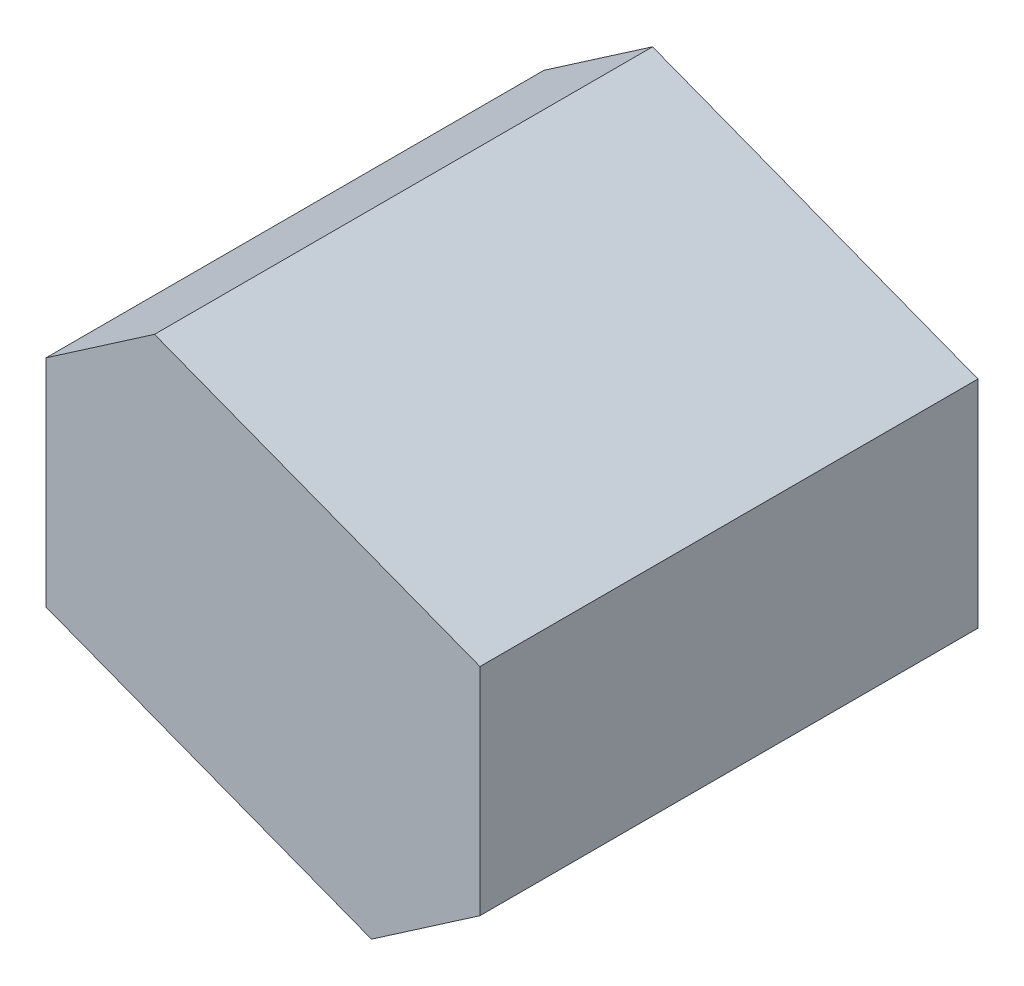
ISO-10303-21;
HEADER;
FILE_DESCRIPTION(('STEP AP214'),'2;1');
FILE_NAME('part.step','',(''),(''),'','','');
FILE_SCHEMA(('AUTOMOTIVE_DESIGN { 1 0 10303 214 1 1 1 1 }'));
ENDSEC;
DATA;
#1=APPLICATION_CONTEXT('core data for automotive mechanical design processes');
#2=APPLICATION_PROTOCOL_DEFINITION('international standard','automotive_design',2000,#1);
#3=PRODUCT_CONTEXT('',#1,'mechanical');
#4=PRODUCT('Part','Part','',(#3));
#5=PRODUCT_RELATED_PRODUCT_CATEGORY('part','',(#4));
#6=PRODUCT_DEFINITION_FORMATION('','',#4);
#7=PRODUCT_DEFINITION_CONTEXT('part definition',#1,'design');
#8=PRODUCT_DEFINITION('design','',#6,#7);
#9=PRODUCT_DEFINITION_SHAPE('','',#8);
#10=(LENGTH_UNIT() NAMED_UNIT(*) SI_UNIT(.MILLI.,.METRE.));
#11=(NAMED_UNIT(*) PLANE_ANGLE_UNIT() SI_UNIT($,.RADIAN.));
#12=(NAMED_UNIT(*) SI_UNIT($,.STERADIAN.) SOLID_ANGLE_UNIT());
#13=UNCERTAINTY_MEASURE_WITH_UNIT(LENGTH_MEASURE(1.E-05),#10,'distance_accuracy_value','');
#14=(GEOMETRIC_REPRESENTATION_CONTEXT(3) GLOBAL_UNCERTAINTY_ASSIGNED_CONTEXT((#13)) GLOBAL_UNIT_ASSIGNED_CONTEXT((#10,
#11,#12)) REPRESENTATION_CONTEXT('',''));
#15=CARTESIAN_POINT('',(0.,0.,0.));
#16=DIRECTION('',(0.,0.,1.));
#17=DIRECTION('',(1.,0.,0.));
#18=AXIS2_PLACEMENT_3D('',#15,#16,#17);
#19=CARTESIAN_POINT('',(33.1981199662404,-0.0871285716620917,38.1));
#20=DIRECTION('',(-0.358367949545305,-0.9335804264972,0.));
#21=DIRECTION('',(0.9335804264972,-0.358367949545305,0.));
#22=AXIS2_PLACEMENT_3D('',#19,#20,#21);
#23=PLANE('',#22);
#24=DIRECTION('',(-0.9335804264972,0.358367949545305,0.));
#25=VECTOR('',#24,1.);
#26=CARTESIAN_POINT('',(33.1981199662404,-0.0871285716620917,-38.1));
#27=LINE('',#26,#25);
#28=CARTESIAN_POINT('',(33.1981199662404,-0.0871285716620917,-38.1));
#29=VERTEX_POINT('',#28);
#30=CARTESIAN_POINT('',(-16.5990599831202,19.0282178570845,-38.1));
#31=VERTEX_POINT('',#30);
#32=EDGE_CURVE('E218',#29,#31,#27,.T.);
#33=ORIENTED_EDGE('',*,*,#32,.T.);
#34=DIRECTION('',(0.,0.,1.));
#35=VECTOR('',#34,1.);
#36=CARTESIAN_POINT('',(-16.5990599831202,19.0282178570845,-38.1));
#37=LINE('',#36,#35);
#38=CARTESIAN_POINT('',(-16.5990599831202,19.0282178570845,38.1));
#39=VERTEX_POINT('',#38);
#40=EDGE_CURVE('E405',#31,#39,#37,.T.);
#41=ORIENTED_EDGE('',*,*,#40,.T.);
#42=DIRECTION('',(-0.9335804264972,0.358367949545305,0.));
#43=VECTOR('',#42,1.);
#44=CARTESIAN_POINT('',(33.1981199662404,-0.0871285716620917,38.1));
#45=LINE('',#44,#43);
#46=CARTESIAN_POINT('',(33.1981199662404,-0.0871285716620917,38.1));
#47=VERTEX_POINT('',#46);
#48=EDGE_CURVE('E220',#47,#39,#45,.T.);
#49=ORIENTED_EDGE('',*,*,#48,.F.);
#50=DIRECTION('',(0.,0.,-1.));
#51=VECTOR('',#50,1.);
#52=CARTESIAN_POINT('',(33.1981199662404,-0.0871285716620917,38.1));
#53=LINE('',#52,#51);
#54=EDGE_CURVE('E232',#47,#29,#53,.T.);
#55=ORIENTED_EDGE('',*,*,#54,.T.);
#56=EDGE_LOOP('',(#33,#41,#49,#55));
#57=FACE_BOUND('',#56,.T.);
#58=ADVANCED_FACE('F47',(#57),#23,.F.);
#59=CARTESIAN_POINT('',(-33.1981199662404,25.4,38.1));
#60=DIRECTION('',(1.,0.,0.));
#61=DIRECTION('',(0.,1.,0.));
#62=AXIS2_PLACEMENT_3D('',#59,#60,#61);
#63=PLANE('',#62);
#64=DIRECTION('',(0.,-1.,0.));
#65=VECTOR('',#64,1.);
#66=CARTESIAN_POINT('',(-33.1981199662404,25.4,38.1));
#67=LINE('',#66,#65);
#68=CARTESIAN_POINT('',(-33.1981199662404,7.62,38.1));
#69=VERTEX_POINT('',#68);
#70=CARTESIAN_POINT('',(-33.1981199662404,-25.4,38.1));
#71=VERTEX_POINT('',#70);
#72=EDGE_CURVE('E226',#69,#71,#67,.T.);
#73=ORIENTED_EDGE('',*,*,#72,.F.);
#74=DIRECTION('',(0.,0.,1.));
#75=VECTOR('',#74,1.);
#76=CARTESIAN_POINT('',(-33.1981199662404,7.62,-38.1));
#77=LINE('',#76,#75);
#78=CARTESIAN_POINT('',(-33.1981199662404,7.62,-38.1));
#79=VERTEX_POINT('',#78);
#80=EDGE_CURVE('E410',#79,#69,#77,.T.);
#81=ORIENTED_EDGE('',*,*,#80,.F.);
#82=DIRECTION('',(0.,-1.,0.));
#83=VECTOR('',#82,1.);
#84=CARTESIAN_POINT('',(-33.1981199662404,25.4,-38.1));
#85=LINE('',#84,#83);
#86=CARTESIAN_POINT('',(-33.1981199662404,-25.4,-38.1));
#87=VERTEX_POINT('',#86);
#88=EDGE_CURVE('E228',#79,#87,#85,.T.);
#89=ORIENTED_EDGE('',*,*,#88,.T.);
#90=DIRECTION('',(0.,0.,-1.));
#91=VECTOR('',#90,1.);
#92=CARTESIAN_POINT('',(-33.1981199662404,-25.4,38.1));
#93=LINE('',#92,#91);
#94=EDGE_CURVE('E235',#71,#87,#93,.T.);
#95=ORIENTED_EDGE('',*,*,#94,.F.);
#96=EDGE_LOOP('',(#73,#81,#89,#95));
#97=FACE_BOUND('',#96,.T.);
#98=ADVANCED_FACE('F433',(#97),#63,.F.);
#99=CARTESIAN_POINT('',(-33.1981199662404,-25.4,38.1));
#100=DIRECTION('',(0.358367949545305,0.9335804264972,0.));
#101=DIRECTION('',(-0.9335804264972,0.358367949545305,0.));
#102=AXIS2_PLACEMENT_3D('',#99,#100,#101);
#103=PLANE('',#102);
#104=DIRECTION('',(0.9335804264972,-0.358367949545305,0.));
#105=VECTOR('',#104,1.);
#106=CARTESIAN_POINT('',(-33.1981199662404,-25.4,-38.1));
#107=LINE('',#106,#105);
#108=CARTESIAN_POINT('',(16.5990599831202,-44.5153464287465,-38.1));
#109=VERTEX_POINT('',#108);
#110=EDGE_CURVE('E221',#87,#109,#107,.T.);
#111=ORIENTED_EDGE('',*,*,#110,.T.);
#112=DIRECTION('',(0.,0.,1.));
#113=VECTOR('',#112,1.);
#114=CARTESIAN_POINT('',(16.5990599831202,-44.5153464287465,-38.1));
#115=LINE('',#114,#113);
#116=CARTESIAN_POINT('',(16.5990599831202,-44.5153464287465,38.1));
#117=VERTEX_POINT('',#116);
#118=EDGE_CURVE('E197',#109,#117,#115,.T.);
#119=ORIENTED_EDGE('',*,*,#118,.T.);
#120=DIRECTION('',(0.9335804264972,-0.358367949545305,0.));
#121=VECTOR('',#120,1.);
#122=CARTESIAN_POINT('',(-33.1981199662404,-25.4,38.1));
#123=LINE('',#122,#121);
#124=EDGE_CURVE('E420',#71,#117,#123,.T.);
#125=ORIENTED_EDGE('',*,*,#124,.F.);
#126=ORIENTED_EDGE('',*,*,#94,.T.);
#127=EDGE_LOOP('',(#111,#119,#125,#126));
#128=FACE_BOUND('',#127,.T.);
#129=ADVANCED_FACE('F436',(#128),#103,.F.);
#130=CARTESIAN_POINT('',(33.1981199662404,-50.8871285716621,38.1));
#131=DIRECTION('',(-1.,0.,0.));
#132=DIRECTION('',(0.,-1.,0.));
#133=AXIS2_PLACEMENT_3D('',#130,#131,#132);
#134=PLANE('',#133);
#135=DIRECTION('',(0.,1.,0.));
#136=VECTOR('',#135,1.);
#137=CARTESIAN_POINT('',(33.1981199662404,-50.8871285716621,38.1));
#138=LINE('',#137,#136);
#139=CARTESIAN_POINT('',(33.1981199662404,-33.1071285716621,38.1));
#140=VERTEX_POINT('',#139);
#141=EDGE_CURVE('E211',#140,#47,#138,.T.);
#142=ORIENTED_EDGE('',*,*,#141,.F.);
#143=DIRECTION('',(0.,0.,1.));
#144=VECTOR('',#143,1.);
#145=CARTESIAN_POINT('',(33.1981199662404,-33.1071285716621,-38.1));
#146=LINE('',#145,#144);
#147=CARTESIAN_POINT('',(33.1981199662404,-33.1071285716621,-38.1));
#148=VERTEX_POINT('',#147);
#149=EDGE_CURVE('E194',#148,#140,#146,.T.);
#150=ORIENTED_EDGE('',*,*,#149,.F.);
#151=DIRECTION('',(0.,1.,0.));
#152=VECTOR('',#151,1.);
#153=CARTESIAN_POINT('',(33.1981199662404,-50.8871285716621,-38.1));
#154=LINE('',#153,#152);
#155=EDGE_CURVE('E209',#148,#29,#154,.T.);
#156=ORIENTED_EDGE('',*,*,#155,.T.);
#157=ORIENTED_EDGE('',*,*,#54,.F.);
#158=EDGE_LOOP('',(#142,#150,#156,#157));
#159=FACE_BOUND('',#158,.T.);
#160=ADVANCED_FACE('F207',(#159),#134,.F.);
#161=CARTESIAN_POINT('',(0.,0.,38.1));
#162=DIRECTION('',(0.,0.,1.));
#163=DIRECTION('',(1.,0.,0.));
#164=AXIS2_PLACEMENT_3D('',#161,#162,#163);
#165=PLANE('',#164);
#166=DIRECTION('',(-0.824126188622017,-0.566406236924831,0.));
#167=VECTOR('',#166,1.);
#168=CARTESIAN_POINT('',(16.5990599831202,-44.5153464287465,38.1));
#169=LINE('',#168,#167);
#170=EDGE_CURVE('E203',#140,#117,#169,.T.);
#171=ORIENTED_EDGE('',*,*,#170,.F.);
#172=ORIENTED_EDGE('',*,*,#141,.T.);
#173=ORIENTED_EDGE('',*,*,#48,.T.);
#174=DIRECTION('',(0.824126188622017,0.566406236924831,0.));
#175=VECTOR('',#174,1.);
#176=CARTESIAN_POINT('',(-16.5990599831202,19.0282178570845,38.1));
#177=LINE('',#176,#175);
#178=EDGE_CURVE('E402',#69,#39,#177,.T.);
#179=ORIENTED_EDGE('',*,*,#178,.F.);
#180=ORIENTED_EDGE('',*,*,#72,.T.);
#181=ORIENTED_EDGE('',*,*,#124,.T.);
#182=EDGE_LOOP('',(#171,#172,#173,#179,#180,#181));
#183=FACE_BOUND('',#182,.T.);
#184=ADVANCED_FACE('F438',(#183),#165,.T.);
#185=CARTESIAN_POINT('',(0.,0.,-38.1));
#186=DIRECTION('',(0.,0.,1.));
#187=DIRECTION('',(1.,0.,0.));
#188=AXIS2_PLACEMENT_3D('',#185,#186,#187);
#189=PLANE('',#188);
#190=DIRECTION('',(-0.824126188622017,-0.566406236924831,0.));
#191=VECTOR('',#190,1.);
#192=CARTESIAN_POINT('',(25.6250156975658,-37.2846291998315,-38.1));
#193=LINE('',#192,#191);
#194=CARTESIAN_POINT('',(24.2188228587639,-38.251078762062,-38.1));
#195=VERTEX_POINT('',#194);
#196=CARTESIAN_POINT('',(24.1959093085186,-38.2668268088396,-38.1));
#197=VERTEX_POINT('',#196);
#198=EDGE_CURVE('E387',#195,#197,#193,.T.);
#199=ORIENTED_EDGE('',*,*,#198,.F.);
#200=CARTESIAN_POINT('',(14.1481199662404,-23.5981151283625,-38.1));
#201=DIRECTION('',(0.,0.,1.));
#202=DIRECTION('',(1.,0.,0.));
#203=AXIS2_PLACEMENT_3D('',#200,#201,#202);
#204=CIRCLE('',#203,17.78);
#205=CARTESIAN_POINT('',(31.9281199662404,-23.5981151283625,-38.1));
#206=VERTEX_POINT('',#205);
#207=EDGE_CURVE('E11',#195,#206,#204,.T.);
#208=ORIENTED_EDGE('',*,*,#207,.T.);
#209=DIRECTION('',(0.,1.,0.));
#210=VECTOR('',#209,1.);
#211=CARTESIAN_POINT('',(31.9281199662404,-50.8871285716621,-38.1));
#212=LINE('',#211,#210);
#213=CARTESIAN_POINT('',(31.9281199662404,-12.7263785454803,-38.1));
#214=VERTEX_POINT('',#213);
#215=EDGE_CURVE('E413',#206,#214,#212,.T.);
#216=ORIENTED_EDGE('',*,*,#215,.T.);
#217=CARTESIAN_POINT('',(14.1481199662404,-12.7263785454803,-38.1));
#218=DIRECTION('',(0.,0.,1.));
#219=DIRECTION('',(1.,0.,0.));
#220=AXIS2_PLACEMENT_3D('',#217,#218,#219);
#221=CIRCLE('',#220,17.78);
#222=CARTESIAN_POINT('',(20.5199021091559,3.8726814376399,-38.1));
#223=VERTEX_POINT('',#222);
#224=EDGE_CURVE('E314',#214,#223,#221,.T.);
#225=ORIENTED_EDGE('',*,*,#224,.T.);
#226=DIRECTION('',(-0.9335804264972,0.358367949545305,0.));
#227=VECTOR('',#226,1.);
#228=CARTESIAN_POINT('',(32.8947020723769,-0.877559208998293,-38.1));
#229=LINE('',#228,#227);
#230=CARTESIAN_POINT('',(-7.75342427307957,14.7257945865983,-38.1));
#231=VERTEX_POINT('',#230);
#232=EDGE_CURVE('E394',#223,#231,#229,.T.);
#233=ORIENTED_EDGE('',*,*,#232,.T.);
#234=CARTESIAN_POINT('',(-14.1252064159951,-1.87326539652195,-38.1));
#235=DIRECTION('',(0.,0.,1.));
#236=DIRECTION('',(1.,0.,0.));
#237=AXIS2_PLACEMENT_3D('',#234,#235,#236);
#238=CIRCLE('',#237,17.78);
#239=CARTESIAN_POINT('',(-24.1959093085186,12.7796982371775,-38.1));
#240=VERTEX_POINT('',#239);
#241=EDGE_CURVE('E311',#231,#240,#238,.T.);
#242=ORIENTED_EDGE('',*,*,#241,.T.);
#243=DIRECTION('',(0.824126188622017,0.566406236924831,0.));
#244=VECTOR('',#243,1.);
#245=CARTESIAN_POINT('',(-13.7278735165052,19.9741799109885,-38.1));
#246=LINE('',#245,#244);
#247=CARTESIAN_POINT('',(-24.6421570387639,12.4730006693607,-38.1));
#248=VERTEX_POINT('',#247);
#249=EDGE_CURVE('E383',#248,#240,#246,.T.);
#250=ORIENTED_EDGE('',*,*,#249,.F.);
#251=CARTESIAN_POINT('',(-14.5714541462404,-2.17996296433876,-38.1));
#252=DIRECTION('',(0.,0.,1.));
#253=DIRECTION('',(1.,0.,0.));
#254=AXIS2_PLACEMENT_3D('',#251,#252,#253);
#255=CIRCLE('',#254,17.78);
#256=CARTESIAN_POINT('',(-32.3514541462404,-2.17996296433876,-38.1));
#257=VERTEX_POINT('',#256);
#258=EDGE_CURVE('E317',#248,#257,#255,.T.);
#259=ORIENTED_EDGE('',*,*,#258,.T.);
#260=DIRECTION('',(0.,-1.,0.));
#261=VECTOR('',#260,1.);
#262=CARTESIAN_POINT('',(-32.3514541462404,25.4,-38.1));
#263=LINE('',#262,#261);
#264=CARTESIAN_POINT('',(-32.3514541462404,-12.5982472596786,-38.1));
#265=VERTEX_POINT('',#264);
#266=EDGE_CURVE('E397',#257,#265,#263,.T.);
#267=ORIENTED_EDGE('',*,*,#266,.T.);
#268=CARTESIAN_POINT('',(-14.5714541462404,-12.5982472596786,-38.1));
#269=DIRECTION('',(0.,0.,1.));
#270=DIRECTION('',(1.,0.,0.));
#271=AXIS2_PLACEMENT_3D('',#268,#269,#270);
#272=CIRCLE('',#271,17.78);
#273=CARTESIAN_POINT('',(-20.9432362891559,-29.1973072427988,-38.1));
#274=VERTEX_POINT('',#273);
#275=EDGE_CURVE('E57',#265,#274,#272,.T.);
#276=ORIENTED_EDGE('',*,*,#275,.T.);
#277=DIRECTION('',(0.9335804264972,-0.358367949545305,0.));
#278=VECTOR('',#277,1.);
#279=CARTESIAN_POINT('',(-32.8947020723769,-24.6095693626638,-38.1));
#280=LINE('',#279,#278);
#281=CARTESIAN_POINT('',(7.75342427307955,-40.2129231582603,-38.1));
#282=VERTEX_POINT('',#281);
#283=EDGE_CURVE('E516',#274,#282,#280,.T.);
#284=ORIENTED_EDGE('',*,*,#283,.T.);
#285=CARTESIAN_POINT('',(14.1252064159951,-23.6138631751401,-38.1));
#286=DIRECTION('',(0.,0.,1.));
#287=DIRECTION('',(1.,0.,0.));
#288=AXIS2_PLACEMENT_3D('',#285,#286,#287);
#289=CIRCLE('',#288,17.78);
#290=EDGE_CURVE('E320',#282,#197,#289,.T.);
#291=ORIENTED_EDGE('',*,*,#290,.T.);
#292=EDGE_LOOP('',(#199,#208,#216,#225,#233,#242,#250,#259,#267,#276,#284,#291));
#293=FACE_BOUND('',#292,.T.);
#294=ORIENTED_EDGE('',*,*,#155,.F.);
#295=DIRECTION('',(-0.824126188622017,-0.566406236924831,0.));
#296=VECTOR('',#295,1.);
#297=CARTESIAN_POINT('',(16.5990599831202,-44.5153464287465,-38.1));
#298=LINE('',#297,#296);
#299=EDGE_CURVE('E191',#148,#109,#298,.T.);
#300=ORIENTED_EDGE('',*,*,#299,.T.);
#301=ORIENTED_EDGE('',*,*,#110,.F.);
#302=ORIENTED_EDGE('',*,*,#88,.F.);
#303=DIRECTION('',(0.824126188622017,0.566406236924831,0.));
#304=VECTOR('',#303,1.);
#305=CARTESIAN_POINT('',(-16.5990599831202,19.0282178570845,-38.1));
#306=LINE('',#305,#304);
#307=EDGE_CURVE('E409',#79,#31,#306,.T.);
#308=ORIENTED_EDGE('',*,*,#307,.T.);
#309=ORIENTED_EDGE('',*,*,#32,.F.);
#310=EDGE_LOOP('',(#294,#300,#301,#302,#308,#309));
#311=FACE_BOUND('',#310,.T.);
#312=ADVANCED_FACE('F215',(#293,#311),#189,.F.);
#313=CARTESIAN_POINT('',(-16.5990599831202,19.0282178570845,-38.1));
#314=DIRECTION('',(0.566406236924831,-0.824126188622017,0.));
#315=DIRECTION('',(0.824126188622017,0.566406236924831,0.));
#316=AXIS2_PLACEMENT_3D('',#313,#314,#315);
#317=PLANE('',#316);
#318=ORIENTED_EDGE('',*,*,#178,.T.);
#319=ORIENTED_EDGE('',*,*,#40,.F.);
#320=ORIENTED_EDGE('',*,*,#307,.F.);
#321=ORIENTED_EDGE('',*,*,#80,.T.);
#322=EDGE_LOOP('',(#318,#319,#320,#321));
#323=FACE_BOUND('',#322,.T.);
#324=ADVANCED_FACE('F442',(#323),#317,.F.);
#325=CARTESIAN_POINT('',(16.5990599831202,-44.5153464287465,-38.1));
#326=DIRECTION('',(-0.566406236924831,0.824126188622017,0.));
#327=DIRECTION('',(-0.824126188622017,-0.566406236924831,0.));
#328=AXIS2_PLACEMENT_3D('',#325,#326,#327);
#329=PLANE('',#328);
#330=ORIENTED_EDGE('',*,*,#170,.T.);
#331=ORIENTED_EDGE('',*,*,#118,.F.);
#332=ORIENTED_EDGE('',*,*,#299,.F.);
#333=ORIENTED_EDGE('',*,*,#149,.T.);
#334=EDGE_LOOP('',(#330,#331,#332,#333));
#335=FACE_BOUND('',#334,.T.);
#336=ADVANCED_FACE('F193',(#335),#329,.F.);
#337=CARTESIAN_POINT('',(32.8947020723769,-0.877559208998293,38.1));
#338=DIRECTION('',(-0.358367949545305,-0.9335804264972,0.));
#339=DIRECTION('',(0.9335804264972,-0.358367949545305,0.));
#340=AXIS2_PLACEMENT_3D('',#337,#338,#339);
#341=PLANE('',#340);
#342=DIRECTION('',(-0.9335804264972,0.358367949545305,0.));
#343=VECTOR('',#342,1.);
#344=CARTESIAN_POINT('',(32.8947020723769,-0.877559208998293,19.47333418));
#345=LINE('',#344,#343);
#346=CARTESIAN_POINT('',(20.5199021091559,3.8726814376399,19.47333418));
#347=VERTEX_POINT('',#346);
#348=CARTESIAN_POINT('',(-7.75342427307956,14.7257945865983,19.47333418));
#349=VERTEX_POINT('',#348);
#350=EDGE_CURVE('E249',#347,#349,#345,.T.);
#351=ORIENTED_EDGE('',*,*,#350,.T.);
#352=DIRECTION('',(0.,0.,1.));
#353=VECTOR('',#352,1.);
#354=CARTESIAN_POINT('',(-7.75342427307956,14.7257945865983,-38.1));
#355=LINE('',#354,#353);
#356=EDGE_CURVE('E255',#349,#231,#355,.F.);
#357=ORIENTED_EDGE('',*,*,#356,.T.);
#358=ORIENTED_EDGE('',*,*,#232,.F.);
#359=DIRECTION('',(0.,0.,-1.));
#360=VECTOR('',#359,1.);
#361=CARTESIAN_POINT('',(20.5199021091559,3.8726814376399,37.25333418));
#362=LINE('',#361,#360);
#363=EDGE_CURVE('E252',#223,#347,#362,.F.);
#364=ORIENTED_EDGE('',*,*,#363,.T.);
#365=EDGE_LOOP('',(#351,#357,#358,#364));
#366=FACE_BOUND('',#365,.T.);
#367=ADVANCED_FACE('F538',(#366),#341,.T.);
#368=CARTESIAN_POINT('',(-32.3514541462404,25.4,38.1));
#369=DIRECTION('',(1.,0.,0.));
#370=DIRECTION('',(0.,1.,0.));
#371=AXIS2_PLACEMENT_3D('',#368,#369,#370);
#372=PLANE('',#371);
#373=ORIENTED_EDGE('',*,*,#266,.F.);
#374=DIRECTION('',(0.,0.,1.));
#375=VECTOR('',#374,1.);
#376=CARTESIAN_POINT('',(-32.3514541462404,-2.17996296433876,37.25333418));
#377=LINE('',#376,#375);
#378=CARTESIAN_POINT('',(-32.3514541462404,-2.17996296433876,19.47333418));
#379=VERTEX_POINT('',#378);
#380=EDGE_CURVE('E289',#257,#379,#377,.T.);
#381=ORIENTED_EDGE('',*,*,#380,.T.);
#382=DIRECTION('',(0.,-1.,0.));
#383=VECTOR('',#382,1.);
#384=CARTESIAN_POINT('',(-32.3514541462404,25.4,19.47333418));
#385=LINE('',#384,#383);
#386=CARTESIAN_POINT('',(-32.3514541462404,-12.5982472596786,19.47333418));
#387=VERTEX_POINT('',#386);
#388=EDGE_CURVE('E286',#379,#387,#385,.T.);
#389=ORIENTED_EDGE('',*,*,#388,.T.);
#390=DIRECTION('',(0.,0.,-1.));
#391=VECTOR('',#390,1.);
#392=CARTESIAN_POINT('',(-32.3514541462404,-12.5982472596786,-38.1));
#393=LINE('',#392,#391);
#394=EDGE_CURVE('E283',#387,#265,#393,.T.);
#395=ORIENTED_EDGE('',*,*,#394,.T.);
#396=EDGE_LOOP('',(#373,#381,#389,#395));
#397=FACE_BOUND('',#396,.T.);
#398=ADVANCED_FACE('F568',(#397),#372,.T.);
#399=CARTESIAN_POINT('',(-32.8947020723769,-24.6095693626638,38.1));
#400=DIRECTION('',(0.358367949545305,0.9335804264972,0.));
#401=DIRECTION('',(-0.9335804264972,0.358367949545305,0.));
#402=AXIS2_PLACEMENT_3D('',#399,#400,#401);
#403=PLANE('',#402);
#404=DIRECTION('',(0.9335804264972,-0.358367949545305,0.));
#405=VECTOR('',#404,1.);
#406=CARTESIAN_POINT('',(-32.8947020723769,-24.6095693626638,19.47333418));
#407=LINE('',#406,#405);
#408=CARTESIAN_POINT('',(-20.9432362891559,-29.1973072427988,19.47333418));
#409=VERTEX_POINT('',#408);
#410=CARTESIAN_POINT('',(7.75342427307955,-40.2129231582603,19.47333418));
#411=VERTEX_POINT('',#410);
#412=EDGE_CURVE('E65',#409,#411,#407,.T.);
#413=ORIENTED_EDGE('',*,*,#412,.T.);
#414=DIRECTION('',(0.,0.,1.));
#415=VECTOR('',#414,1.);
#416=CARTESIAN_POINT('',(7.75342427307955,-40.2129231582603,-38.1));
#417=LINE('',#416,#415);
#418=EDGE_CURVE('E308',#411,#282,#417,.F.);
#419=ORIENTED_EDGE('',*,*,#418,.T.);
#420=ORIENTED_EDGE('',*,*,#283,.F.);
#421=DIRECTION('',(0.,0.,-1.));
#422=VECTOR('',#421,1.);
#423=CARTESIAN_POINT('',(-20.9432362891559,-29.1973072427988,37.25333418));
#424=LINE('',#423,#422);
#425=EDGE_CURVE('E70',#274,#409,#424,.F.);
#426=ORIENTED_EDGE('',*,*,#425,.T.);
#427=EDGE_LOOP('',(#413,#419,#420,#426));
#428=FACE_BOUND('',#427,.T.);
#429=ADVANCED_FACE('F572',(#428),#403,.T.);
#430=CARTESIAN_POINT('',(31.9281199662404,-50.8871285716621,38.1));
#431=DIRECTION('',(-1.,0.,0.));
#432=DIRECTION('',(0.,-1.,0.));
#433=AXIS2_PLACEMENT_3D('',#430,#431,#432);
#434=PLANE('',#433);
#435=DIRECTION('',(0.,1.,0.));
#436=VECTOR('',#435,1.);
#437=CARTESIAN_POINT('',(31.9281199662404,-50.8871285716621,19.47333418));
#438=LINE('',#437,#436);
#439=CARTESIAN_POINT('',(31.9281199662404,-23.5981151283625,19.47333418));
#440=VERTEX_POINT('',#439);
#441=CARTESIAN_POINT('',(31.9281199662404,-12.7263785454803,19.47333418));
#442=VERTEX_POINT('',#441);
#443=EDGE_CURVE('E261',#440,#442,#438,.T.);
#444=ORIENTED_EDGE('',*,*,#443,.T.);
#445=DIRECTION('',(0.,0.,-1.));
#446=VECTOR('',#445,1.);
#447=CARTESIAN_POINT('',(31.9281199662404,-12.7263785454803,-38.1));
#448=LINE('',#447,#446);
#449=EDGE_CURVE('E264',#442,#214,#448,.T.);
#450=ORIENTED_EDGE('',*,*,#449,.T.);
#451=ORIENTED_EDGE('',*,*,#215,.F.);
#452=DIRECTION('',(0.,0.,1.));
#453=VECTOR('',#452,1.);
#454=CARTESIAN_POINT('',(31.9281199662404,-23.5981151283625,37.25333418));
#455=LINE('',#454,#453);
#456=EDGE_CURVE('E258',#206,#440,#455,.T.);
#457=ORIENTED_EDGE('',*,*,#456,.T.);
#458=EDGE_LOOP('',(#444,#450,#451,#457));
#459=FACE_BOUND('',#458,.T.);
#460=ADVANCED_FACE('F527',(#459),#434,.T.);
#461=CARTESIAN_POINT('',(0.,0.,37.25333418));
#462=DIRECTION('',(0.,0.,1.));
#463=DIRECTION('',(1.,0.,0.));
#464=AXIS2_PLACEMENT_3D('',#461,#462,#463);
#465=PLANE('',#464);
#466=DIRECTION('',(0.824126188622017,0.566406236924831,0.));
#467=VECTOR('',#466,1.);
#468=CARTESIAN_POINT('',(-3.65717062398166,5.32121627728899,37.25333418));
#469=LINE('',#468,#467);
#470=CARTESIAN_POINT('',(-14.5714541462404,-2.17996296433876,37.25333418));
#471=VERTEX_POINT('',#470);
#472=CARTESIAN_POINT('',(-14.1252064159951,-1.87326539652195,37.25333418));
#473=VERTEX_POINT('',#472);
#474=EDGE_CURVE('E276',#471,#473,#469,.T.);
#475=ORIENTED_EDGE('',*,*,#474,.T.);
#476=DIRECTION('',(-0.9335804264972,0.358367949545305,0.));
#477=VECTOR('',#476,1.);
#478=CARTESIAN_POINT('',(-2.44079578489708,-6.35849040838601,37.25333418));
#479=LINE('',#478,#477);
#480=CARTESIAN_POINT('',(14.1481199662404,-12.7263785454803,37.25333418));
#481=VERTEX_POINT('',#480);
#482=EDGE_CURVE('E279',#473,#481,#479,.F.);
#483=ORIENTED_EDGE('',*,*,#482,.T.);
#484=DIRECTION('',(0.,1.,0.));
#485=VECTOR('',#484,1.);
#486=CARTESIAN_POINT('',(14.1481199662404,0.,37.25333418));
#487=LINE('',#486,#485);
#488=CARTESIAN_POINT('',(14.1481199662404,-23.6226588629943,37.25333418));
#489=VERTEX_POINT('',#488);
#490=EDGE_CURVE('E267',#481,#489,#487,.F.);
#491=ORIENTED_EDGE('',*,*,#490,.T.);
#492=DIRECTION('',(0.9335804264972,-0.358367949545305,0.));
#493=VECTOR('',#492,1.);
#494=CARTESIAN_POINT('',(-6.08631311285423,-15.8553877345988,37.25333418));
#495=LINE('',#494,#493);
#496=CARTESIAN_POINT('',(-14.5714541462404,-12.5982472596786,37.25333418));
#497=VERTEX_POINT('',#496);
#498=EDGE_CURVE('E270',#489,#497,#495,.F.);
#499=ORIENTED_EDGE('',*,*,#498,.T.);
#500=DIRECTION('',(0.,-1.,0.));
#501=VECTOR('',#500,1.);
#502=CARTESIAN_POINT('',(-14.5714541462404,0.,37.25333418));
#503=LINE('',#502,#501);
#504=EDGE_CURVE('E273',#497,#471,#503,.F.);
#505=ORIENTED_EDGE('',*,*,#504,.T.);
#506=EDGE_LOOP('',(#475,#483,#491,#499,#505));
#507=FACE_BOUND('',#506,.T.);
#508=ADVANCED_FACE('F558',(#507),#465,.F.);
#509=CARTESIAN_POINT('',(-16.1195031820811,18.3304583818113,-38.1));
#510=DIRECTION('',(0.566406236924831,-0.824126188622017,0.));
#511=DIRECTION('',(0.824126188622017,0.566406236924831,0.));
#512=AXIS2_PLACEMENT_3D('',#509,#510,#511);
#513=PLANE('',#512);
#514=ORIENTED_EDGE('',*,*,#249,.T.);
#515=DIRECTION('',(0.,0.,1.));
#516=VECTOR('',#515,1.);
#517=CARTESIAN_POINT('',(-24.1959093085186,12.7796982371775,37.25333418));
#518=LINE('',#517,#516);
#519=CARTESIAN_POINT('',(-24.1959093085186,12.7796982371775,19.47333418));
#520=VERTEX_POINT('',#519);
#521=EDGE_CURVE('E245',#240,#520,#518,.T.);
#522=ORIENTED_EDGE('',*,*,#521,.T.);
#523=DIRECTION('',(0.824126188622017,0.566406236924831,0.));
#524=VECTOR('',#523,1.);
#525=CARTESIAN_POINT('',(-16.1195031820811,18.3304583818113,19.47333418));
#526=LINE('',#525,#524);
#527=CARTESIAN_POINT('',(-24.6421570387639,12.4730006693607,19.47333418));
#528=VERTEX_POINT('',#527);
#529=EDGE_CURVE('E242',#520,#528,#526,.F.);
#530=ORIENTED_EDGE('',*,*,#529,.T.);
#531=DIRECTION('',(0.,0.,1.));
#532=VECTOR('',#531,1.);
#533=CARTESIAN_POINT('',(-24.6421570387639,12.4730006693607,-38.1));
#534=LINE('',#533,#532);
#535=EDGE_CURVE('E239',#528,#248,#534,.F.);
#536=ORIENTED_EDGE('',*,*,#535,.T.);
#537=EDGE_LOOP('',(#514,#522,#530,#536));
#538=FACE_BOUND('',#537,.T.);
#539=ADVANCED_FACE('F585',(#538),#513,.T.);
#540=CARTESIAN_POINT('',(16.1195031820811,-43.8175869534734,-38.1));
#541=DIRECTION('',(-0.566406236924831,0.824126188622017,0.));
#542=DIRECTION('',(-0.824126188622017,-0.566406236924831,0.));
#543=AXIS2_PLACEMENT_3D('',#540,#541,#542);
#544=PLANE('',#543);
#545=ORIENTED_EDGE('',*,*,#198,.T.);
#546=DIRECTION('',(0.,0.,1.));
#547=VECTOR('',#546,1.);
#548=CARTESIAN_POINT('',(24.1959093085186,-38.2668268088396,37.25333418));
#549=LINE('',#548,#547);
#550=CARTESIAN_POINT('',(24.1959093085186,-38.2668268088396,34.1262978136995));
#551=VERTEX_POINT('',#550);
#552=EDGE_CURVE('E301',#197,#551,#549,.T.);
#553=ORIENTED_EDGE('',*,*,#552,.T.);
#554=CARTESIAN_POINT('',(34.2666122010421,-31.345424471074,19.47333418));
#555=DIRECTION('',(-0.566406236924831,0.824126188622017,0.));
#556=DIRECTION('',(0.824126188622017,0.566406236924831,0.));
#557=AXIS2_PLACEMENT_3D('',#554,#555,#556);
#558=ELLIPSE('',#557,21.574365971465,17.78);
#559=CARTESIAN_POINT('',(24.2073660836412,-38.2589527854508,34.1341652461284));
#560=VERTEX_POINT('',#559);
#561=EDGE_CURVE('E298',#551,#560,#558,.T.);
#562=ORIENTED_EDGE('',*,*,#561,.T.);
#563=CARTESIAN_POINT('',(14.1481199662404,-45.1724810998275,19.47333418));
#564=DIRECTION('',(-0.566406236924831,0.824126188622017,0.));
#565=DIRECTION('',(0.824126188622017,0.566406236924831,0.));
#566=AXIS2_PLACEMENT_3D('',#563,#564,#565);
#567=ELLIPSE('',#566,21.574365971465,17.78);
#568=CARTESIAN_POINT('',(24.2188228587639,-38.251078762062,34.1262978136995));
#569=VERTEX_POINT('',#568);
#570=EDGE_CURVE('E295',#560,#569,#567,.T.);
#571=ORIENTED_EDGE('',*,*,#570,.T.);
#572=DIRECTION('',(0.,0.,1.));
#573=VECTOR('',#572,1.);
#574=CARTESIAN_POINT('',(24.2188228587639,-38.251078762062,-38.1));
#575=LINE('',#574,#573);
#576=EDGE_CURVE('E292',#569,#195,#575,.F.);
#577=ORIENTED_EDGE('',*,*,#576,.T.);
#578=EDGE_LOOP('',(#545,#553,#562,#571,#577));
#579=FACE_BOUND('',#578,.T.);
#580=ADVANCED_FACE('F507',(#579),#544,.T.);
#581=CARTESIAN_POINT('',(-14.5714541462404,-12.5982472596786,38.1));
#582=DIRECTION('',(0.,0.,1.));
#583=DIRECTION('',(1.,0.,0.));
#584=AXIS2_PLACEMENT_3D('',#581,#582,#583);
#585=CYLINDRICAL_SURFACE('',#584,17.78);
#586=ORIENTED_EDGE('',*,*,#275,.F.);
#587=ORIENTED_EDGE('',*,*,#394,.F.);
#588=CARTESIAN_POINT('',(-14.5714541462404,-12.5982472596786,19.47333418));
#589=DIRECTION('',(0.,0.,-1.));
#590=DIRECTION('',(-1.,0.,0.));
#591=AXIS2_PLACEMENT_3D('',#588,#589,#590);
#592=CIRCLE('',#591,17.78);
#593=EDGE_CURVE('E51',#409,#387,#592,.T.);
#594=ORIENTED_EDGE('',*,*,#593,.F.);
#595=ORIENTED_EDGE('',*,*,#425,.F.);
#596=EDGE_LOOP('',(#586,#587,#594,#595));
#597=FACE_BOUND('',#596,.T.);
#598=ADVANCED_FACE('F49',(#597),#585,.F.);
#599=CARTESIAN_POINT('',(14.1252064159951,-23.6138631751401,-38.1));
#600=DIRECTION('',(0.,0.,-1.));
#601=DIRECTION('',(-1.,0.,0.));
#602=AXIS2_PLACEMENT_3D('',#599,#600,#601);
#603=CYLINDRICAL_SURFACE('',#602,17.78);
#604=ORIENTED_EDGE('',*,*,#290,.F.);
#605=ORIENTED_EDGE('',*,*,#418,.F.);
#606=CARTESIAN_POINT('',(14.1252064159951,-23.6138631751401,19.47333418));
#607=DIRECTION('',(0.660141050359199,-0.253404407283404,-0.707106781186547));
#608=DIRECTION('',(-0.660141050359199,0.253404407283404,-0.707106781186547));
#609=AXIS2_PLACEMENT_3D('',#606,#607,#608);
#610=ELLIPSE('',#609,25.1447171389936,17.78);
#611=EDGE_CURVE('E371',#551,#411,#610,.T.);
#612=ORIENTED_EDGE('',*,*,#611,.F.);
#613=ORIENTED_EDGE('',*,*,#552,.F.);
#614=EDGE_LOOP('',(#604,#605,#612,#613));
#615=FACE_BOUND('',#614,.T.);
#616=ADVANCED_FACE('F501',(#615),#603,.F.);
#617=CARTESIAN_POINT('',(-14.5714541462404,-12.5982472596786,19.47333418));
#618=DIRECTION('',(0.,0.,1.));
#619=DIRECTION('',(0.,-1.,0.));
#620=AXIS2_PLACEMENT_3D('',#617,#618,#619);
#621=SPHERICAL_SURFACE('',#620,17.78);
#622=CARTESIAN_POINT('',(-14.5714541462404,-12.5982472596786,19.47333418));
#623=DIRECTION('',(0.,1.,0.));
#624=DIRECTION('',(0.,0.,1.));
#625=AXIS2_PLACEMENT_3D('',#622,#623,#624);
#626=CIRCLE('',#625,17.78);
#627=EDGE_CURVE('E367',#497,#387,#626,.F.);
#628=ORIENTED_EDGE('',*,*,#627,.F.);
#629=CARTESIAN_POINT('',(-14.5714541462404,-12.5982472596786,19.47333418));
#630=DIRECTION('',(0.9335804264972,-0.358367949545305,0.));
#631=DIRECTION('',(0.358367949545305,0.9335804264972,0.));
#632=AXIS2_PLACEMENT_3D('',#629,#630,#631);
#633=CIRCLE('',#632,17.78);
#634=EDGE_CURVE('E374',#409,#497,#633,.F.);
#635=ORIENTED_EDGE('',*,*,#634,.F.);
#636=ORIENTED_EDGE('',*,*,#593,.T.);
#637=EDGE_LOOP('',(#628,#635,#636));
#638=FACE_BOUND('',#637,.T.);
#639=ADVANCED_FACE('F499',(#638),#621,.F.);
#640=CARTESIAN_POINT('',(-26.5229199294614,-8.01050937954358,19.47333418));
#641=DIRECTION('',(0.9335804264972,-0.358367949545305,0.));
#642=DIRECTION('',(0.358367949545305,0.9335804264972,0.));
#643=AXIS2_PLACEMENT_3D('',#640,#641,#642);
#644=CYLINDRICAL_SURFACE('',#643,17.78);
#645=ORIENTED_EDGE('',*,*,#634,.T.);
#646=ORIENTED_EDGE('',*,*,#498,.F.);
#647=CARTESIAN_POINT('',(14.1481199662404,-23.6226588629943,19.47333418));
#648=DIRECTION('',(0.824126188622017,0.566406236924831,0.));
#649=DIRECTION('',(0.566406236924831,-0.824126188622017,0.));
#650=AXIS2_PLACEMENT_3D('',#647,#648,#649);
#651=ELLIPSE('',#650,31.3908972763653,17.78);
#652=EDGE_CURVE('E363',#560,#489,#651,.F.);
#653=ORIENTED_EDGE('',*,*,#652,.F.);
#654=ORIENTED_EDGE('',*,*,#561,.F.);
#655=ORIENTED_EDGE('',*,*,#611,.T.);
#656=ORIENTED_EDGE('',*,*,#412,.F.);
#657=EDGE_LOOP('',(#645,#646,#653,#654,#655,#656));
#658=FACE_BOUND('',#657,.T.);
#659=ADVANCED_FACE('F495',(#658),#644,.F.);
#660=CARTESIAN_POINT('',(14.1481199662404,-23.5981151283625,38.1));
#661=DIRECTION('',(0.,0.,-1.));
#662=DIRECTION('',(-1.,0.,0.));
#663=AXIS2_PLACEMENT_3D('',#660,#661,#662);
#664=CYLINDRICAL_SURFACE('',#663,17.78);
#665=ORIENTED_EDGE('',*,*,#207,.F.);
#666=ORIENTED_EDGE('',*,*,#576,.F.);
#667=CARTESIAN_POINT('',(14.1481199662404,-23.5981151283625,19.47333418));
#668=DIRECTION('',(0.,0.707106781186547,0.707106781186547));
#669=DIRECTION('',(0.,0.707106781186547,-0.707106781186547));
#670=AXIS2_PLACEMENT_3D('',#667,#668,#669);
#671=ELLIPSE('',#670,25.1447171389936,17.78);
#672=EDGE_CURVE('E359',#440,#569,#671,.F.);
#673=ORIENTED_EDGE('',*,*,#672,.F.);
#674=ORIENTED_EDGE('',*,*,#456,.F.);
#675=EDGE_LOOP('',(#665,#666,#673,#674));
#676=FACE_BOUND('',#675,.T.);
#677=ADVANCED_FACE('F491',(#676),#664,.F.);
#678=CARTESIAN_POINT('',(-14.5714541462404,-2.17996296433876,38.1));
#679=DIRECTION('',(0.,0.,-1.));
#680=DIRECTION('',(-1.,0.,0.));
#681=AXIS2_PLACEMENT_3D('',#678,#679,#680);
#682=CYLINDRICAL_SURFACE('',#681,17.78);
#683=ORIENTED_EDGE('',*,*,#258,.F.);
#684=ORIENTED_EDGE('',*,*,#535,.F.);
#685=CARTESIAN_POINT('',(-14.5714541462404,-2.17996296433876,19.47333418));
#686=DIRECTION('',(0.,0.,-1.));
#687=DIRECTION('',(-1.,0.,0.));
#688=AXIS2_PLACEMENT_3D('',#685,#686,#687);
#689=CIRCLE('',#688,17.78);
#690=EDGE_CURVE('E355',#379,#528,#689,.T.);
#691=ORIENTED_EDGE('',*,*,#690,.F.);
#692=ORIENTED_EDGE('',*,*,#380,.F.);
#693=EDGE_LOOP('',(#683,#684,#691,#692));
#694=FACE_BOUND('',#693,.T.);
#695=ADVANCED_FACE('F487',(#694),#682,.F.);
#696=CARTESIAN_POINT('',(-14.5714541462404,25.4,19.47333418));
#697=DIRECTION('',(0.,-1.,0.));
#698=DIRECTION('',(1.,0.,0.));
#699=AXIS2_PLACEMENT_3D('',#696,#697,#698);
#700=CYLINDRICAL_SURFACE('',#699,17.78);
#701=ORIENTED_EDGE('',*,*,#627,.T.);
#702=ORIENTED_EDGE('',*,*,#388,.F.);
#703=CARTESIAN_POINT('',(-14.5714541462404,-2.17996296433876,19.47333418));
#704=DIRECTION('',(0.,-1.,0.));
#705=DIRECTION('',(1.,0.,0.));
#706=AXIS2_PLACEMENT_3D('',#703,#704,#705);
#707=CIRCLE('',#706,17.78);
#708=EDGE_CURVE('E351',#471,#379,#707,.T.);
#709=ORIENTED_EDGE('',*,*,#708,.F.);
#710=ORIENTED_EDGE('',*,*,#504,.F.);
#711=EDGE_LOOP('',(#701,#702,#709,#710));
#712=FACE_BOUND('',#711,.T.);
#713=ADVANCED_FACE('F483',(#712),#700,.F.);
#714=CARTESIAN_POINT('',(14.1481199662404,-50.8871285716621,19.47333418));
#715=DIRECTION('',(0.,1.,0.));
#716=DIRECTION('',(-1.,0.,0.));
#717=AXIS2_PLACEMENT_3D('',#714,#715,#716);
#718=CYLINDRICAL_SURFACE('',#717,17.78);
#719=ORIENTED_EDGE('',*,*,#652,.T.);
#720=ORIENTED_EDGE('',*,*,#490,.F.);
#721=CARTESIAN_POINT('',(14.1481199662404,-12.7263785454803,19.47333418));
#722=DIRECTION('',(0.,-1.,0.));
#723=DIRECTION('',(0.,0.,-1.));
#724=AXIS2_PLACEMENT_3D('',#721,#722,#723);
#725=CIRCLE('',#724,17.78);
#726=EDGE_CURVE('E347',#442,#481,#725,.T.);
#727=ORIENTED_EDGE('',*,*,#726,.F.);
#728=ORIENTED_EDGE('',*,*,#443,.F.);
#729=ORIENTED_EDGE('',*,*,#672,.T.);
#730=ORIENTED_EDGE('',*,*,#570,.F.);
#731=EDGE_LOOP('',(#719,#720,#727,#728,#729,#730));
#732=FACE_BOUND('',#731,.T.);
#733=ADVANCED_FACE('F479',(#732),#718,.F.);
#734=CARTESIAN_POINT('',(14.1481199662404,-12.7263785454803,38.1));
#735=DIRECTION('',(0.,0.,1.));
#736=DIRECTION('',(1.,0.,0.));
#737=AXIS2_PLACEMENT_3D('',#734,#735,#736);
#738=CYLINDRICAL_SURFACE('',#737,17.78);
#739=ORIENTED_EDGE('',*,*,#224,.F.);
#740=ORIENTED_EDGE('',*,*,#449,.F.);
#741=CARTESIAN_POINT('',(14.1481199662404,-12.7263785454803,19.47333418));
#742=DIRECTION('',(0.,0.,-1.));
#743=DIRECTION('',(-1.,0.,0.));
#744=AXIS2_PLACEMENT_3D('',#741,#742,#743);
#745=CIRCLE('',#744,17.78);
#746=EDGE_CURVE('E343',#347,#442,#745,.T.);
#747=ORIENTED_EDGE('',*,*,#746,.F.);
#748=ORIENTED_EDGE('',*,*,#363,.F.);
#749=EDGE_LOOP('',(#739,#740,#747,#748));
#750=FACE_BOUND('',#749,.T.);
#751=ADVANCED_FACE('F475',(#750),#738,.F.);
#752=CARTESIAN_POINT('',(-14.5714541462404,-2.17996296433876,19.47333418));
#753=DIRECTION('',(0.,0.,1.));
#754=DIRECTION('',(0.,-1.,0.));
#755=AXIS2_PLACEMENT_3D('',#752,#753,#754);
#756=SPHERICAL_SURFACE('',#755,17.78);
#757=ORIENTED_EDGE('',*,*,#708,.T.);
#758=ORIENTED_EDGE('',*,*,#690,.T.);
#759=CARTESIAN_POINT('',(-14.5714541462404,-2.17996296433876,19.47333418));
#760=DIRECTION('',(0.824126188622017,0.566406236924831,0.));
#761=DIRECTION('',(-0.566406236924831,0.824126188622017,0.));
#762=AXIS2_PLACEMENT_3D('',#759,#760,#761);
#763=CIRCLE('',#762,17.78);
#764=EDGE_CURVE('E339',#471,#528,#763,.F.);
#765=ORIENTED_EDGE('',*,*,#764,.F.);
#766=EDGE_LOOP('',(#757,#758,#765));
#767=FACE_BOUND('',#766,.T.);
#768=ADVANCED_FACE('F471',(#767),#756,.F.);
#769=CARTESIAN_POINT('',(14.1481199662404,-12.7263785454803,19.47333418));
#770=DIRECTION('',(0.,0.,1.));
#771=DIRECTION('',(1.,0.,0.));
#772=AXIS2_PLACEMENT_3D('',#769,#770,#771);
#773=SPHERICAL_SURFACE('',#772,17.78);
#774=ORIENTED_EDGE('',*,*,#746,.T.);
#775=ORIENTED_EDGE('',*,*,#726,.T.);
#776=CARTESIAN_POINT('',(14.1481199662404,-12.7263785454803,19.47333418));
#777=DIRECTION('',(-0.9335804264972,0.358367949545305,0.));
#778=DIRECTION('',(-0.358367949545305,-0.9335804264972,0.));
#779=AXIS2_PLACEMENT_3D('',#776,#777,#778);
#780=CIRCLE('',#779,17.78);
#781=EDGE_CURVE('E336',#347,#481,#780,.F.);
#782=ORIENTED_EDGE('',*,*,#781,.F.);
#783=EDGE_LOOP('',(#774,#775,#782));
#784=FACE_BOUND('',#783,.T.);
#785=ADVANCED_FACE('F467',(#784),#773,.F.);
#786=CARTESIAN_POINT('',(-3.65717062398166,5.32121627728899,19.47333418));
#787=DIRECTION('',(0.824126188622017,0.566406236924831,0.));
#788=DIRECTION('',(-0.566406236924831,0.824126188622017,0.));
#789=AXIS2_PLACEMENT_3D('',#786,#787,#788);
#790=CYLINDRICAL_SURFACE('',#789,17.78);
#791=ORIENTED_EDGE('',*,*,#764,.T.);
#792=ORIENTED_EDGE('',*,*,#529,.F.);
#793=CARTESIAN_POINT('',(-14.1252064159951,-1.87326539652195,19.47333418));
#794=DIRECTION('',(-0.824126188622017,-0.566406236924831,0.));
#795=DIRECTION('',(0.566406236924831,-0.824126188622017,0.));
#796=AXIS2_PLACEMENT_3D('',#793,#794,#795);
#797=CIRCLE('',#796,17.78);
#798=EDGE_CURVE('E332',#473,#520,#797,.T.);
#799=ORIENTED_EDGE('',*,*,#798,.F.);
#800=ORIENTED_EDGE('',*,*,#474,.F.);
#801=EDGE_LOOP('',(#791,#792,#799,#800));
#802=FACE_BOUND('',#801,.T.);
#803=ADVANCED_FACE('F463',(#802),#790,.F.);
#804=CARTESIAN_POINT('',(26.5229199294614,-17.4766191921185,19.47333418));
#805=DIRECTION('',(-0.9335804264972,0.358367949545305,0.));
#806=DIRECTION('',(-0.358367949545305,-0.9335804264972,0.));
#807=AXIS2_PLACEMENT_3D('',#804,#805,#806);
#808=CYLINDRICAL_SURFACE('',#807,17.78);
#809=ORIENTED_EDGE('',*,*,#781,.T.);
#810=ORIENTED_EDGE('',*,*,#482,.F.);
#811=CARTESIAN_POINT('',(-14.1252064159951,-1.87326539652195,19.47333418));
#812=DIRECTION('',(0.9335804264972,-0.358367949545305,0.));
#813=DIRECTION('',(0.358367949545305,0.9335804264972,0.));
#814=AXIS2_PLACEMENT_3D('',#811,#812,#813);
#815=CIRCLE('',#814,17.78);
#816=EDGE_CURVE('E328',#349,#473,#815,.T.);
#817=ORIENTED_EDGE('',*,*,#816,.F.);
#818=ORIENTED_EDGE('',*,*,#350,.F.);
#819=EDGE_LOOP('',(#809,#810,#817,#818));
#820=FACE_BOUND('',#819,.T.);
#821=ADVANCED_FACE('F459',(#820),#808,.F.);
#822=CARTESIAN_POINT('',(-14.1252064159951,-1.87326539652195,19.47333418));
#823=DIRECTION('',(0.,0.,1.));
#824=DIRECTION('',(0.,-1.,0.));
#825=AXIS2_PLACEMENT_3D('',#822,#823,#824);
#826=SPHERICAL_SURFACE('',#825,17.78);
#827=ORIENTED_EDGE('',*,*,#816,.T.);
#828=ORIENTED_EDGE('',*,*,#798,.T.);
#829=CARTESIAN_POINT('',(-14.1252064159951,-1.87326539652195,19.47333418));
#830=DIRECTION('',(0.,0.,-1.));
#831=DIRECTION('',(-1.,0.,0.));
#832=AXIS2_PLACEMENT_3D('',#829,#830,#831);
#833=CIRCLE('',#832,17.78);
#834=EDGE_CURVE('E325',#349,#520,#833,.F.);
#835=ORIENTED_EDGE('',*,*,#834,.F.);
#836=EDGE_LOOP('',(#827,#828,#835));
#837=FACE_BOUND('',#836,.T.);
#838=ADVANCED_FACE('F455',(#837),#826,.F.);
#839=CARTESIAN_POINT('',(-14.1252064159951,-1.87326539652195,-38.1));
#840=DIRECTION('',(0.,0.,-1.));
#841=DIRECTION('',(-1.,0.,0.));
#842=AXIS2_PLACEMENT_3D('',#839,#840,#841);
#843=CYLINDRICAL_SURFACE('',#842,17.78);
#844=ORIENTED_EDGE('',*,*,#241,.F.);
#845=ORIENTED_EDGE('',*,*,#356,.F.);
#846=ORIENTED_EDGE('',*,*,#834,.T.);
#847=ORIENTED_EDGE('',*,*,#521,.F.);
#848=EDGE_LOOP('',(#844,#845,#846,#847));
#849=FACE_BOUND('',#848,.T.);
#850=ADVANCED_FACE('F452',(#849),#843,.F.);
#851=CLOSED_SHELL('',(#58,#98,#129,#160,#184,#312,#324,#336,#367,#398,#429,#460,#508,#539,#580,
#598,#616,#639,#659,#677,#695,#713,#733,#751,#768,#785,#803,#821,#838,#850));
#852=MANIFOLD_SOLID_BREP('B2',#851);
#853=ADVANCED_BREP_SHAPE_REPRESENTATION('',(#18,#852),#14);
#854=SHAPE_DEFINITION_REPRESENTATION(#9,#853);
ENDSEC;
END-ISO-10303-21;
